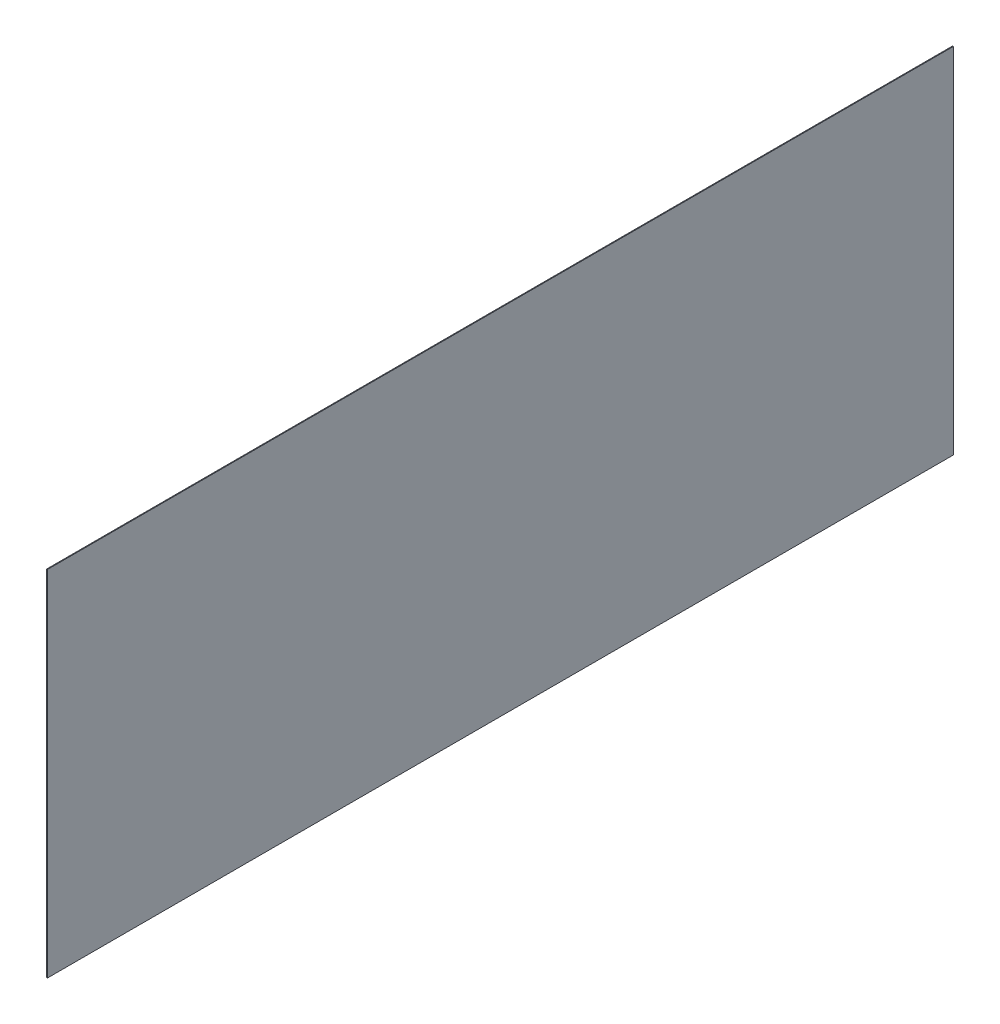
ISO-10303-21;
HEADER;
FILE_DESCRIPTION(('STEP AP214'),'2;1');
FILE_NAME('part.step','',(''),(''),'','','');
FILE_SCHEMA(('AUTOMOTIVE_DESIGN { 1 0 10303 214 1 1 1 1 }'));
ENDSEC;
DATA;
#1=APPLICATION_CONTEXT('core data for automotive mechanical design processes');
#2=APPLICATION_PROTOCOL_DEFINITION('international standard','automotive_design',2000,#1);
#3=PRODUCT_CONTEXT('',#1,'mechanical');
#4=PRODUCT('Part','Part','',(#3));
#5=PRODUCT_RELATED_PRODUCT_CATEGORY('part','',(#4));
#6=PRODUCT_DEFINITION_FORMATION('','',#4);
#7=PRODUCT_DEFINITION_CONTEXT('part definition',#1,'design');
#8=PRODUCT_DEFINITION('design','',#6,#7);
#9=PRODUCT_DEFINITION_SHAPE('','',#8);
#10=(LENGTH_UNIT() NAMED_UNIT(*) SI_UNIT(.MILLI.,.METRE.));
#11=(NAMED_UNIT(*) PLANE_ANGLE_UNIT() SI_UNIT($,.RADIAN.));
#12=(NAMED_UNIT(*) SI_UNIT($,.STERADIAN.) SOLID_ANGLE_UNIT());
#13=UNCERTAINTY_MEASURE_WITH_UNIT(LENGTH_MEASURE(1.E-05),#10,'distance_accuracy_value','');
#14=(GEOMETRIC_REPRESENTATION_CONTEXT(3) GLOBAL_UNCERTAINTY_ASSIGNED_CONTEXT((#13)) GLOBAL_UNIT_ASSIGNED_CONTEXT((#10,
#11,#12)) REPRESENTATION_CONTEXT('',''));
#15=CARTESIAN_POINT('',(0.,0.,0.));
#16=DIRECTION('',(0.,0.,1.));
#17=DIRECTION('',(1.,0.,0.));
#18=AXIS2_PLACEMENT_3D('',#15,#16,#17);
#19=CARTESIAN_POINT('',(5.,1123.5,-2876.));
#20=DIRECTION('',(0.,0.,1.));
#21=DIRECTION('',(0.,-1.,0.));
#22=AXIS2_PLACEMENT_3D('',#19,#20,#21);
#23=PLANE('',#22);
#24=DIRECTION('',(0.,1.,0.));
#25=VECTOR('',#24,1.);
#26=CARTESIAN_POINT('',(0.,1123.5,-2876.));
#27=LINE('',#26,#25);
#28=CARTESIAN_POINT('',(0.,-1123.5,-2876.));
#29=VERTEX_POINT('',#28);
#30=CARTESIAN_POINT('',(0.,1123.5,-2876.));
#31=VERTEX_POINT('',#30);
#32=EDGE_CURVE('E109',#29,#31,#27,.T.);
#33=ORIENTED_EDGE('',*,*,#32,.T.);
#34=DIRECTION('',(-1.,0.,0.));
#35=VECTOR('',#34,1.);
#36=CARTESIAN_POINT('',(5.,1123.5,-2876.));
#37=LINE('',#36,#35);
#38=CARTESIAN_POINT('',(5.,1123.5,-2876.));
#39=VERTEX_POINT('',#38);
#40=EDGE_CURVE('E11',#39,#31,#37,.T.);
#41=ORIENTED_EDGE('',*,*,#40,.F.);
#42=DIRECTION('',(0.,1.,0.));
#43=VECTOR('',#42,1.);
#44=CARTESIAN_POINT('',(5.,1123.5,-2876.));
#45=LINE('',#44,#43);
#46=CARTESIAN_POINT('',(5.,-1123.5,-2876.));
#47=VERTEX_POINT('',#46);
#48=EDGE_CURVE('E93',#47,#39,#45,.T.);
#49=ORIENTED_EDGE('',*,*,#48,.F.);
#50=DIRECTION('',(-1.,0.,0.));
#51=VECTOR('',#50,1.);
#52=CARTESIAN_POINT('',(5.,-1123.5,-2876.));
#53=LINE('',#52,#51);
#54=EDGE_CURVE('E105',#47,#29,#53,.T.);
#55=ORIENTED_EDGE('',*,*,#54,.T.);
#56=EDGE_LOOP('',(#33,#41,#49,#55));
#57=FACE_BOUND('',#56,.T.);
#58=ADVANCED_FACE('F41',(#57),#23,.F.);
#59=CARTESIAN_POINT('',(5.,1123.5,2876.));
#60=DIRECTION('',(0.,-1.,0.));
#61=DIRECTION('',(0.,0.,-1.));
#62=AXIS2_PLACEMENT_3D('',#59,#60,#61);
#63=PLANE('',#62);
#64=DIRECTION('',(0.,0.,1.));
#65=VECTOR('',#64,1.);
#66=CARTESIAN_POINT('',(0.,1123.5,2876.));
#67=LINE('',#66,#65);
#68=CARTESIAN_POINT('',(0.,1123.5,2876.));
#69=VERTEX_POINT('',#68);
#70=EDGE_CURVE('E98',#31,#69,#67,.T.);
#71=ORIENTED_EDGE('',*,*,#70,.T.);
#72=DIRECTION('',(-1.,0.,0.));
#73=VECTOR('',#72,1.);
#74=CARTESIAN_POINT('',(5.,1123.5,2876.));
#75=LINE('',#74,#73);
#76=CARTESIAN_POINT('',(5.,1123.5,2876.));
#77=VERTEX_POINT('',#76);
#78=EDGE_CURVE('E50',#77,#69,#75,.T.);
#79=ORIENTED_EDGE('',*,*,#78,.F.);
#80=DIRECTION('',(0.,0.,1.));
#81=VECTOR('',#80,1.);
#82=CARTESIAN_POINT('',(5.,1123.5,2876.));
#83=LINE('',#82,#81);
#84=EDGE_CURVE('E88',#39,#77,#83,.T.);
#85=ORIENTED_EDGE('',*,*,#84,.F.);
#86=ORIENTED_EDGE('',*,*,#40,.T.);
#87=EDGE_LOOP('',(#71,#79,#85,#86));
#88=FACE_BOUND('',#87,.T.);
#89=ADVANCED_FACE('F97',(#88),#63,.F.);
#90=CARTESIAN_POINT('',(5.,1123.5,2876.));
#91=DIRECTION('',(0.,0.,-1.));
#92=DIRECTION('',(-1.,0.,0.));
#93=AXIS2_PLACEMENT_3D('',#90,#91,#92);
#94=PLANE('',#93);
#95=DIRECTION('',(0.,-1.,0.));
#96=VECTOR('',#95,1.);
#97=CARTESIAN_POINT('',(0.,1123.5,2876.));
#98=LINE('',#97,#96);
#99=CARTESIAN_POINT('',(0.,-1123.5,2876.));
#100=VERTEX_POINT('',#99);
#101=EDGE_CURVE('E75',#69,#100,#98,.T.);
#102=ORIENTED_EDGE('',*,*,#101,.T.);
#103=DIRECTION('',(-1.,0.,0.));
#104=VECTOR('',#103,1.);
#105=CARTESIAN_POINT('',(5.,-1123.5,2876.));
#106=LINE('',#105,#104);
#107=CARTESIAN_POINT('',(5.,-1123.5,2876.));
#108=VERTEX_POINT('',#107);
#109=EDGE_CURVE('E100',#108,#100,#106,.T.);
#110=ORIENTED_EDGE('',*,*,#109,.F.);
#111=DIRECTION('',(0.,-1.,0.));
#112=VECTOR('',#111,1.);
#113=CARTESIAN_POINT('',(5.,1123.5,2876.));
#114=LINE('',#113,#112);
#115=EDGE_CURVE('E91',#77,#108,#114,.T.);
#116=ORIENTED_EDGE('',*,*,#115,.F.);
#117=ORIENTED_EDGE('',*,*,#78,.T.);
#118=EDGE_LOOP('',(#102,#110,#116,#117));
#119=FACE_BOUND('',#118,.T.);
#120=ADVANCED_FACE('F101',(#119),#94,.F.);
#121=CARTESIAN_POINT('',(5.,-1123.5,2876.));
#122=DIRECTION('',(0.,1.,0.));
#123=DIRECTION('',(0.,0.,1.));
#124=AXIS2_PLACEMENT_3D('',#121,#122,#123);
#125=PLANE('',#124);
#126=DIRECTION('',(0.,0.,-1.));
#127=VECTOR('',#126,1.);
#128=CARTESIAN_POINT('',(0.,-1123.5,2876.));
#129=LINE('',#128,#127);
#130=EDGE_CURVE('E81',#100,#29,#129,.T.);
#131=ORIENTED_EDGE('',*,*,#130,.T.);
#132=ORIENTED_EDGE('',*,*,#54,.F.);
#133=DIRECTION('',(0.,0.,-1.));
#134=VECTOR('',#133,1.);
#135=CARTESIAN_POINT('',(5.,-1123.5,2876.));
#136=LINE('',#135,#134);
#137=EDGE_CURVE('E58',#108,#47,#136,.T.);
#138=ORIENTED_EDGE('',*,*,#137,.F.);
#139=ORIENTED_EDGE('',*,*,#109,.T.);
#140=EDGE_LOOP('',(#131,#132,#138,#139));
#141=FACE_BOUND('',#140,.T.);
#142=ADVANCED_FACE('F122',(#141),#125,.F.);
#143=CARTESIAN_POINT('',(5.,0.,0.));
#144=DIRECTION('',(1.,0.,0.));
#145=DIRECTION('',(0.,0.,-1.));
#146=AXIS2_PLACEMENT_3D('',#143,#144,#145);
#147=PLANE('',#146);
#148=ORIENTED_EDGE('',*,*,#48,.T.);
#149=ORIENTED_EDGE('',*,*,#84,.T.);
#150=ORIENTED_EDGE('',*,*,#115,.T.);
#151=ORIENTED_EDGE('',*,*,#137,.T.);
#152=EDGE_LOOP('',(#148,#149,#150,#151));
#153=FACE_BOUND('',#152,.T.);
#154=ADVANCED_FACE('F89',(#153),#147,.T.);
#155=CARTESIAN_POINT('',(0.,0.,0.));
#156=DIRECTION('',(1.,0.,0.));
#157=DIRECTION('',(0.,0.,-1.));
#158=AXIS2_PLACEMENT_3D('',#155,#156,#157);
#159=PLANE('',#158);
#160=ORIENTED_EDGE('',*,*,#32,.F.);
#161=ORIENTED_EDGE('',*,*,#130,.F.);
#162=ORIENTED_EDGE('',*,*,#101,.F.);
#163=ORIENTED_EDGE('',*,*,#70,.F.);
#164=EDGE_LOOP('',(#160,#161,#162,#163));
#165=FACE_BOUND('',#164,.T.);
#166=ADVANCED_FACE('F125',(#165),#159,.F.);
#167=CLOSED_SHELL('',(#58,#89,#120,#142,#154,#166));
#168=MANIFOLD_SOLID_BREP('B2',#167);
#169=ADVANCED_BREP_SHAPE_REPRESENTATION('',(#18,#168),#14);
#170=SHAPE_DEFINITION_REPRESENTATION(#9,#169);
ENDSEC;
END-ISO-10303-21;
